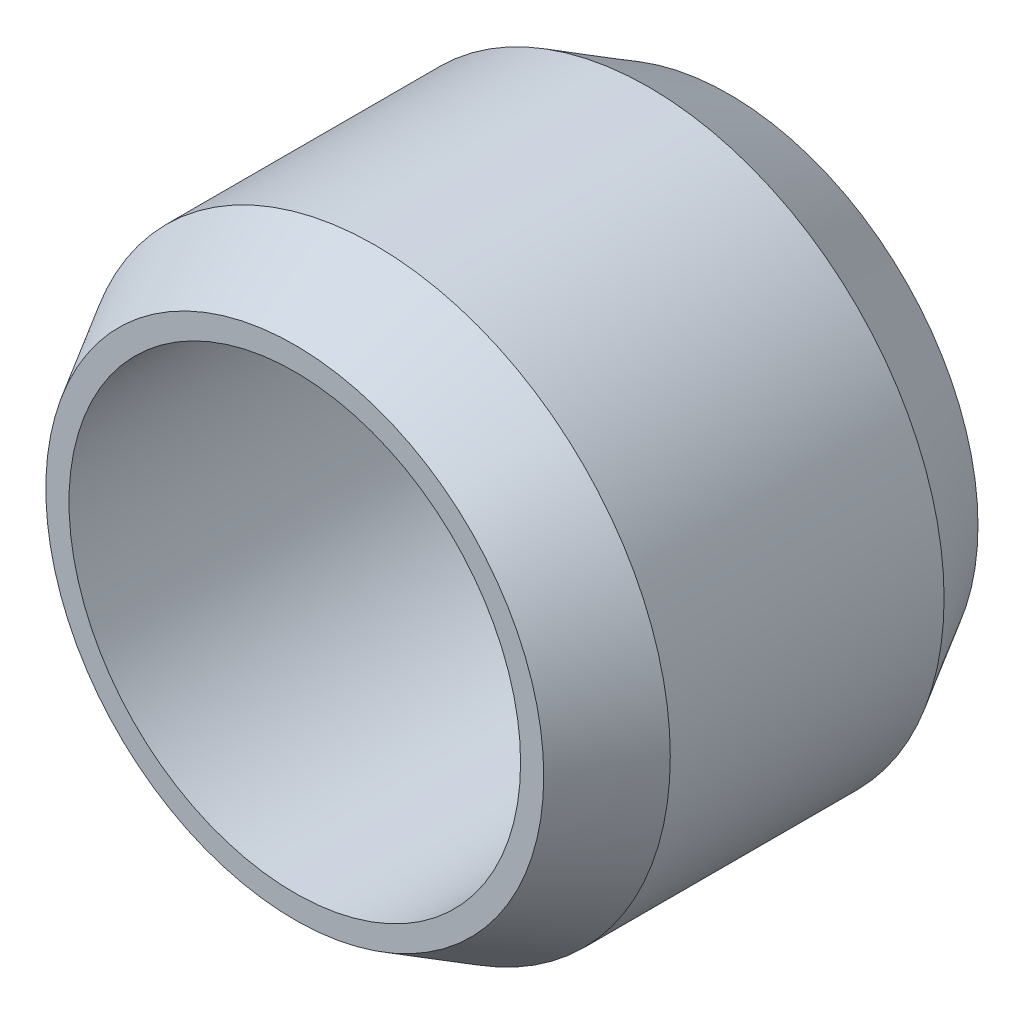
ISO-10303-21;
HEADER;
FILE_DESCRIPTION(('STEP AP214'),'2;1');
FILE_NAME('part.step','',(''),(''),'','','');
FILE_SCHEMA(('AUTOMOTIVE_DESIGN { 1 0 10303 214 1 1 1 1 }'));
ENDSEC;
DATA;
#1=APPLICATION_CONTEXT('core data for automotive mechanical design processes');
#2=APPLICATION_PROTOCOL_DEFINITION('international standard','automotive_design',2000,#1);
#3=PRODUCT_CONTEXT('',#1,'mechanical');
#4=PRODUCT('Part','Part','',(#3));
#5=PRODUCT_RELATED_PRODUCT_CATEGORY('part','',(#4));
#6=PRODUCT_DEFINITION_FORMATION('','',#4);
#7=PRODUCT_DEFINITION_CONTEXT('part definition',#1,'design');
#8=PRODUCT_DEFINITION('design','',#6,#7);
#9=PRODUCT_DEFINITION_SHAPE('','',#8);
#10=(LENGTH_UNIT() NAMED_UNIT(*) SI_UNIT(.MILLI.,.METRE.));
#11=(NAMED_UNIT(*) PLANE_ANGLE_UNIT() SI_UNIT($,.RADIAN.));
#12=(NAMED_UNIT(*) SI_UNIT($,.STERADIAN.) SOLID_ANGLE_UNIT());
#13=UNCERTAINTY_MEASURE_WITH_UNIT(LENGTH_MEASURE(1.E-05),#10,'distance_accuracy_value','');
#14=(GEOMETRIC_REPRESENTATION_CONTEXT(3) GLOBAL_UNCERTAINTY_ASSIGNED_CONTEXT((#13)) GLOBAL_UNIT_ASSIGNED_CONTEXT((#10,
#11,#12)) REPRESENTATION_CONTEXT('',''));
#15=CARTESIAN_POINT('',(0.,0.,0.));
#16=DIRECTION('',(0.,0.,1.));
#17=DIRECTION('',(1.,0.,0.));
#18=AXIS2_PLACEMENT_3D('',#15,#16,#17);
#19=CARTESIAN_POINT('',(0.,0.,3.175));
#20=DIRECTION('',(0.,0.,1.));
#21=DIRECTION('',(1.,0.,0.));
#22=AXIS2_PLACEMENT_3D('',#19,#20,#21);
#23=CYLINDRICAL_SURFACE('',#22,3.302);
#24=CARTESIAN_POINT('',(0.,0.,-3.175));
#25=DIRECTION('',(0.,0.,1.));
#26=DIRECTION('',(1.,0.,0.));
#27=AXIS2_PLACEMENT_3D('',#24,#25,#26);
#28=CIRCLE('',#27,3.302);
#29=CARTESIAN_POINT('',(3.302,0.,-3.175));
#30=VERTEX_POINT('',#29);
#31=EDGE_CURVE('E10',#30,#30,#28,.T.);
#32=ORIENTED_EDGE('',*,*,#31,.F.);
#33=EDGE_LOOP('',(#32));
#34=FACE_BOUND('',#33,.T.);
#35=CARTESIAN_POINT('',(0.,0.,3.175));
#36=DIRECTION('',(0.,0.,1.));
#37=DIRECTION('',(1.,0.,0.));
#38=AXIS2_PLACEMENT_3D('',#35,#36,#37);
#39=CIRCLE('',#38,3.302);
#40=CARTESIAN_POINT('',(3.302,0.,3.175));
#41=VERTEX_POINT('',#40);
#42=EDGE_CURVE('E56',#41,#41,#39,.T.);
#43=ORIENTED_EDGE('',*,*,#42,.T.);
#44=EDGE_LOOP('',(#43));
#45=FACE_BOUND('',#44,.T.);
#46=ADVANCED_FACE('F34',(#34,#45),#23,.F.);
#47=CARTESIAN_POINT('',(0.,3.302,-3.175));
#48=DIRECTION('',(0.,0.,1.));
#49=DIRECTION('',(1.,0.,0.));
#50=AXIS2_PLACEMENT_3D('',#47,#48,#49);
#51=PLANE('',#50);
#52=CARTESIAN_POINT('',(0.,0.,-3.175));
#53=DIRECTION('',(0.,0.,1.));
#54=DIRECTION('',(1.,0.,0.));
#55=AXIS2_PLACEMENT_3D('',#52,#53,#54);
#56=CIRCLE('',#55,3.64066666666667);
#57=CARTESIAN_POINT('',(3.64066666666667,0.,-3.175));
#58=VERTEX_POINT('',#57);
#59=EDGE_CURVE('E40',#58,#58,#56,.T.);
#60=ORIENTED_EDGE('',*,*,#59,.F.);
#61=EDGE_LOOP('',(#60));
#62=FACE_BOUND('',#61,.T.);
#63=ORIENTED_EDGE('',*,*,#31,.T.);
#64=EDGE_LOOP('',(#63));
#65=FACE_BOUND('',#64,.T.);
#66=ADVANCED_FACE('F81',(#62,#65),#51,.F.);
#67=CARTESIAN_POINT('',(0.,0.,-3.175));
#68=DIRECTION('',(0.,0.,1.));
#69=DIRECTION('',(1.,0.,0.));
#70=AXIS2_PLACEMENT_3D('',#67,#68,#69);
#71=CONICAL_SURFACE('',#70,3.64066666666667,0.5235987755983);
#72=CARTESIAN_POINT('',(0.,0.,-2.00182425300668));
#73=DIRECTION('',(0.,0.,1.));
#74=DIRECTION('',(1.,0.,0.));
#75=AXIS2_PLACEMENT_3D('',#72,#73,#74);
#76=CIRCLE('',#75,4.318);
#77=CARTESIAN_POINT('',(4.318,0.,-2.00182425300668));
#78=VERTEX_POINT('',#77);
#79=EDGE_CURVE('E44',#78,#78,#76,.T.);
#80=ORIENTED_EDGE('',*,*,#79,.F.);
#81=EDGE_LOOP('',(#80));
#82=FACE_BOUND('',#81,.T.);
#83=ORIENTED_EDGE('',*,*,#59,.T.);
#84=EDGE_LOOP('',(#83));
#85=FACE_BOUND('',#84,.T.);
#86=ADVANCED_FACE('F76',(#82,#85),#71,.T.);
#87=CARTESIAN_POINT('',(0.,0.,3.175));
#88=DIRECTION('',(0.,0.,1.));
#89=DIRECTION('',(1.,0.,0.));
#90=AXIS2_PLACEMENT_3D('',#87,#88,#89);
#91=CYLINDRICAL_SURFACE('',#90,4.318);
#92=CARTESIAN_POINT('',(0.,0.,2.00182425300668));
#93=DIRECTION('',(0.,0.,1.));
#94=DIRECTION('',(1.,0.,0.));
#95=AXIS2_PLACEMENT_3D('',#92,#93,#94);
#96=CIRCLE('',#95,4.318);
#97=CARTESIAN_POINT('',(4.318,0.,2.00182425300668));
#98=VERTEX_POINT('',#97);
#99=EDGE_CURVE('E48',#98,#98,#96,.T.);
#100=ORIENTED_EDGE('',*,*,#99,.F.);
#101=EDGE_LOOP('',(#100));
#102=FACE_BOUND('',#101,.T.);
#103=ORIENTED_EDGE('',*,*,#79,.T.);
#104=EDGE_LOOP('',(#103));
#105=FACE_BOUND('',#104,.T.);
#106=ADVANCED_FACE('F70',(#102,#105),#91,.T.);
#107=CARTESIAN_POINT('',(0.,0.,2.00182425300668));
#108=DIRECTION('',(0.,0.,-1.));
#109=DIRECTION('',(-1.,0.,0.));
#110=AXIS2_PLACEMENT_3D('',#107,#108,#109);
#111=CONICAL_SURFACE('',#110,4.318,0.5235987755983);
#112=CARTESIAN_POINT('',(0.,0.,3.175));
#113=DIRECTION('',(0.,0.,1.));
#114=DIRECTION('',(1.,0.,0.));
#115=AXIS2_PLACEMENT_3D('',#112,#113,#114);
#116=CIRCLE('',#115,3.64066666666667);
#117=CARTESIAN_POINT('',(3.64066666666667,0.,3.175));
#118=VERTEX_POINT('',#117);
#119=EDGE_CURVE('E53',#118,#118,#116,.T.);
#120=ORIENTED_EDGE('',*,*,#119,.F.);
#121=EDGE_LOOP('',(#120));
#122=FACE_BOUND('',#121,.T.);
#123=ORIENTED_EDGE('',*,*,#99,.T.);
#124=EDGE_LOOP('',(#123));
#125=FACE_BOUND('',#124,.T.);
#126=ADVANCED_FACE('F64',(#122,#125),#111,.T.);
#127=CARTESIAN_POINT('',(0.,3.302,3.175));
#128=DIRECTION('',(0.,0.,-1.));
#129=DIRECTION('',(-1.,0.,0.));
#130=AXIS2_PLACEMENT_3D('',#127,#128,#129);
#131=PLANE('',#130);
#132=ORIENTED_EDGE('',*,*,#42,.F.);
#133=EDGE_LOOP('',(#132));
#134=FACE_BOUND('',#133,.T.);
#135=ORIENTED_EDGE('',*,*,#119,.T.);
#136=EDGE_LOOP('',(#135));
#137=FACE_BOUND('',#136,.T.);
#138=ADVANCED_FACE('F61',(#134,#137),#131,.F.);
#139=CLOSED_SHELL('',(#46,#66,#86,#106,#126,#138));
#140=MANIFOLD_SOLID_BREP('B2',#139);
#141=ADVANCED_BREP_SHAPE_REPRESENTATION('',(#18,#140),#14);
#142=SHAPE_DEFINITION_REPRESENTATION(#9,#141);
ENDSEC;
END-ISO-10303-21;
